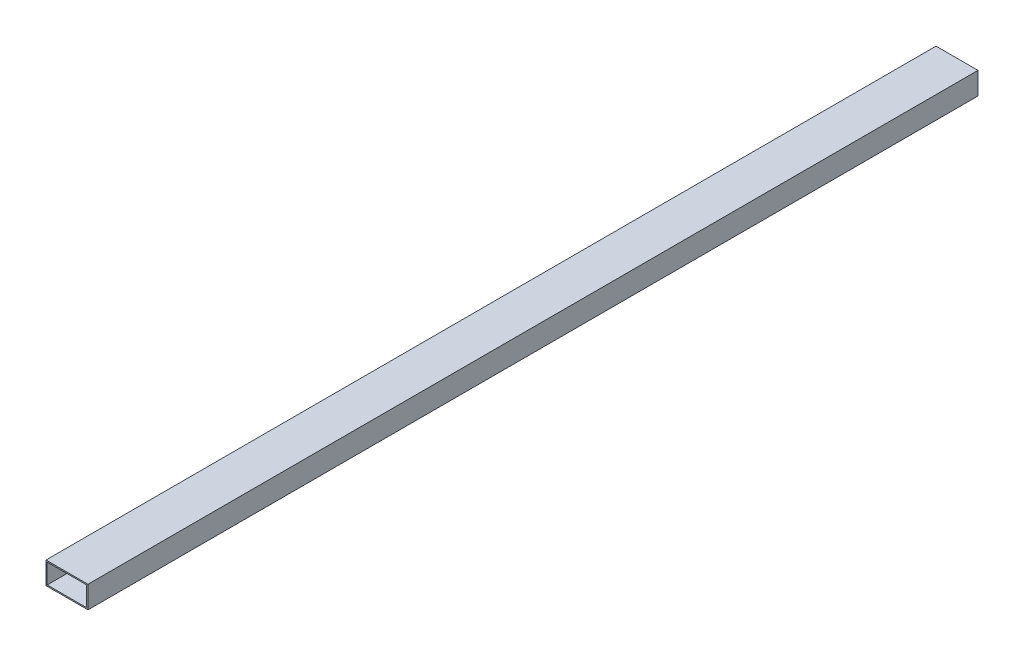
ISO-10303-21;
HEADER;
FILE_DESCRIPTION(('STEP AP214'),'2;1');
FILE_NAME('part.step','',(''),(''),'','','');
FILE_SCHEMA(('AUTOMOTIVE_DESIGN { 1 0 10303 214 1 1 1 1 }'));
ENDSEC;
DATA;
#1=APPLICATION_CONTEXT('core data for automotive mechanical design processes');
#2=APPLICATION_PROTOCOL_DEFINITION('international standard','automotive_design',2000,#1);
#3=PRODUCT_CONTEXT('',#1,'mechanical');
#4=PRODUCT('Part','Part','',(#3));
#5=PRODUCT_RELATED_PRODUCT_CATEGORY('part','',(#4));
#6=PRODUCT_DEFINITION_FORMATION('','',#4);
#7=PRODUCT_DEFINITION_CONTEXT('part definition',#1,'design');
#8=PRODUCT_DEFINITION('design','',#6,#7);
#9=PRODUCT_DEFINITION_SHAPE('','',#8);
#10=(LENGTH_UNIT() NAMED_UNIT(*) SI_UNIT(.MILLI.,.METRE.));
#11=(NAMED_UNIT(*) PLANE_ANGLE_UNIT() SI_UNIT($,.RADIAN.));
#12=(NAMED_UNIT(*) SI_UNIT($,.STERADIAN.) SOLID_ANGLE_UNIT());
#13=UNCERTAINTY_MEASURE_WITH_UNIT(LENGTH_MEASURE(1.E-05),#10,'distance_accuracy_value','');
#14=(GEOMETRIC_REPRESENTATION_CONTEXT(3) GLOBAL_UNCERTAINTY_ASSIGNED_CONTEXT((#13)) GLOBAL_UNIT_ASSIGNED_CONTEXT((#10,
#11,#12)) REPRESENTATION_CONTEXT('',''));
#15=CARTESIAN_POINT('',(0.,0.,0.));
#16=DIRECTION('',(0.,0.,1.));
#17=DIRECTION('',(1.,0.,0.));
#18=AXIS2_PLACEMENT_3D('',#15,#16,#17);
#19=CARTESIAN_POINT('',(0.,0.,1144.5875));
#20=DIRECTION('',(0.,0.,1.));
#21=DIRECTION('',(1.,0.,0.));
#22=AXIS2_PLACEMENT_3D('',#19,#20,#21);
#23=PLANE('',#22);
#24=DIRECTION('',(0.,-1.,0.));
#25=VECTOR('',#24,1.);
#26=CARTESIAN_POINT('',(-1.5875,0.,1144.5875));
#27=LINE('',#26,#25);
#28=CARTESIAN_POINT('',(-1.5875,1.5875,1144.5875));
#29=VERTEX_POINT('',#28);
#30=CARTESIAN_POINT('',(-1.5875,-26.9875,1144.5875));
#31=VERTEX_POINT('',#30);
#32=EDGE_CURVE('E160',#29,#31,#27,.T.);
#33=ORIENTED_EDGE('',*,*,#32,.T.);
#34=DIRECTION('',(1.,0.,0.));
#35=VECTOR('',#34,1.);
#36=CARTESIAN_POINT('',(0.,-26.9875,1144.5875));
#37=LINE('',#36,#35);
#38=CARTESIAN_POINT('',(52.3875,-26.9875,1144.5875));
#39=VERTEX_POINT('',#38);
#40=EDGE_CURVE('E163',#31,#39,#37,.T.);
#41=ORIENTED_EDGE('',*,*,#40,.T.);
#42=DIRECTION('',(0.,1.,0.));
#43=VECTOR('',#42,1.);
#44=CARTESIAN_POINT('',(52.3875,0.,1144.5875));
#45=LINE('',#44,#43);
#46=CARTESIAN_POINT('',(52.3875,1.5875,1144.5875));
#47=VERTEX_POINT('',#46);
#48=EDGE_CURVE('E166',#39,#47,#45,.T.);
#49=ORIENTED_EDGE('',*,*,#48,.T.);
#50=DIRECTION('',(-1.,0.,0.));
#51=VECTOR('',#50,1.);
#52=CARTESIAN_POINT('',(0.,1.5875,1144.5875));
#53=LINE('',#52,#51);
#54=EDGE_CURVE('E168',#47,#29,#53,.T.);
#55=ORIENTED_EDGE('',*,*,#54,.T.);
#56=EDGE_LOOP('',(#33,#41,#49,#55));
#57=FACE_BOUND('',#56,.T.);
#58=DIRECTION('',(1.,0.,0.));
#59=VECTOR('',#58,1.);
#60=CARTESIAN_POINT('',(0.,-25.4,1144.5875));
#61=LINE('',#60,#59);
#62=CARTESIAN_POINT('',(0.,-25.4,1144.5875));
#63=VERTEX_POINT('',#62);
#64=CARTESIAN_POINT('',(50.8,-25.4,1144.5875));
#65=VERTEX_POINT('',#64);
#66=EDGE_CURVE('E132',#63,#65,#61,.T.);
#67=ORIENTED_EDGE('',*,*,#66,.F.);
#68=DIRECTION('',(0.,-1.,0.));
#69=VECTOR('',#68,1.);
#70=CARTESIAN_POINT('',(0.,0.,1144.5875));
#71=LINE('',#70,#69);
#72=CARTESIAN_POINT('',(0.,0.,1144.5875));
#73=VERTEX_POINT('',#72);
#74=EDGE_CURVE('E124',#73,#63,#71,.T.);
#75=ORIENTED_EDGE('',*,*,#74,.F.);
#76=DIRECTION('',(-1.,0.,0.));
#77=VECTOR('',#76,1.);
#78=CARTESIAN_POINT('',(0.,0.,1144.5875));
#79=LINE('',#78,#77);
#80=CARTESIAN_POINT('',(50.8,0.,1144.5875));
#81=VERTEX_POINT('',#80);
#82=EDGE_CURVE('E146',#81,#73,#79,.T.);
#83=ORIENTED_EDGE('',*,*,#82,.F.);
#84=DIRECTION('',(0.,1.,0.));
#85=VECTOR('',#84,1.);
#86=CARTESIAN_POINT('',(50.8,0.,1144.5875));
#87=LINE('',#86,#85);
#88=EDGE_CURVE('E144',#65,#81,#87,.T.);
#89=ORIENTED_EDGE('',*,*,#88,.F.);
#90=EDGE_LOOP('',(#67,#75,#83,#89));
#91=FACE_BOUND('',#90,.T.);
#92=ADVANCED_FACE('F59',(#57,#91),#23,.T.);
#93=CARTESIAN_POINT('',(0.,0.,0.));
#94=DIRECTION('',(0.,0.,1.));
#95=DIRECTION('',(1.,0.,0.));
#96=AXIS2_PLACEMENT_3D('',#93,#94,#95);
#97=PLANE('',#96);
#98=DIRECTION('',(0.,-1.,0.));
#99=VECTOR('',#98,1.);
#100=CARTESIAN_POINT('',(-1.5875,0.,0.));
#101=LINE('',#100,#99);
#102=CARTESIAN_POINT('',(-1.5875,1.5875,0.));
#103=VERTEX_POINT('',#102);
#104=CARTESIAN_POINT('',(-1.5875,-26.9875,0.));
#105=VERTEX_POINT('',#104);
#106=EDGE_CURVE('E140',#103,#105,#101,.T.);
#107=ORIENTED_EDGE('',*,*,#106,.F.);
#108=DIRECTION('',(-1.,0.,0.));
#109=VECTOR('',#108,1.);
#110=CARTESIAN_POINT('',(0.,1.5875,0.));
#111=LINE('',#110,#109);
#112=CARTESIAN_POINT('',(52.3875,1.5875,0.));
#113=VERTEX_POINT('',#112);
#114=EDGE_CURVE('E164',#113,#103,#111,.T.);
#115=ORIENTED_EDGE('',*,*,#114,.F.);
#116=DIRECTION('',(0.,1.,0.));
#117=VECTOR('',#116,1.);
#118=CARTESIAN_POINT('',(52.3875,0.,0.));
#119=LINE('',#118,#117);
#120=CARTESIAN_POINT('',(52.3875,-26.9875,0.));
#121=VERTEX_POINT('',#120);
#122=EDGE_CURVE('E175',#121,#113,#119,.T.);
#123=ORIENTED_EDGE('',*,*,#122,.F.);
#124=DIRECTION('',(1.,0.,0.));
#125=VECTOR('',#124,1.);
#126=CARTESIAN_POINT('',(0.,-26.9875,0.));
#127=LINE('',#126,#125);
#128=EDGE_CURVE('E173',#105,#121,#127,.T.);
#129=ORIENTED_EDGE('',*,*,#128,.F.);
#130=EDGE_LOOP('',(#107,#115,#123,#129));
#131=FACE_BOUND('',#130,.T.);
#132=DIRECTION('',(0.,-1.,0.));
#133=VECTOR('',#132,1.);
#134=CARTESIAN_POINT('',(0.,0.,0.));
#135=LINE('',#134,#133);
#136=CARTESIAN_POINT('',(0.,0.,0.));
#137=VERTEX_POINT('',#136);
#138=CARTESIAN_POINT('',(0.,-25.4,0.));
#139=VERTEX_POINT('',#138);
#140=EDGE_CURVE('E82',#137,#139,#135,.T.);
#141=ORIENTED_EDGE('',*,*,#140,.T.);
#142=DIRECTION('',(1.,0.,0.));
#143=VECTOR('',#142,1.);
#144=CARTESIAN_POINT('',(0.,-25.4,0.));
#145=LINE('',#144,#143);
#146=CARTESIAN_POINT('',(50.8,-25.4,0.));
#147=VERTEX_POINT('',#146);
#148=EDGE_CURVE('E139',#139,#147,#145,.T.);
#149=ORIENTED_EDGE('',*,*,#148,.T.);
#150=DIRECTION('',(0.,1.,0.));
#151=VECTOR('',#150,1.);
#152=CARTESIAN_POINT('',(50.8,0.,0.));
#153=LINE('',#152,#151);
#154=CARTESIAN_POINT('',(50.8,0.,0.));
#155=VERTEX_POINT('',#154);
#156=EDGE_CURVE('E152',#147,#155,#153,.T.);
#157=ORIENTED_EDGE('',*,*,#156,.T.);
#158=DIRECTION('',(-1.,0.,0.));
#159=VECTOR('',#158,1.);
#160=CARTESIAN_POINT('',(0.,0.,0.));
#161=LINE('',#160,#159);
#162=EDGE_CURVE('E133',#155,#137,#161,.T.);
#163=ORIENTED_EDGE('',*,*,#162,.T.);
#164=EDGE_LOOP('',(#141,#149,#157,#163));
#165=FACE_BOUND('',#164,.T.);
#166=ADVANCED_FACE('F193',(#131,#165),#97,.F.);
#167=CARTESIAN_POINT('',(-1.5875,0.,1144.5875));
#168=DIRECTION('',(1.,0.,0.));
#169=DIRECTION('',(0.,1.,0.));
#170=AXIS2_PLACEMENT_3D('',#167,#168,#169);
#171=PLANE('',#170);
#172=ORIENTED_EDGE('',*,*,#106,.T.);
#173=DIRECTION('',(0.,0.,-1.));
#174=VECTOR('',#173,1.);
#175=CARTESIAN_POINT('',(-1.5875,-26.9875,1144.5875));
#176=LINE('',#175,#174);
#177=EDGE_CURVE('E12',#31,#105,#176,.T.);
#178=ORIENTED_EDGE('',*,*,#177,.F.);
#179=ORIENTED_EDGE('',*,*,#32,.F.);
#180=DIRECTION('',(0.,0.,-1.));
#181=VECTOR('',#180,1.);
#182=CARTESIAN_POINT('',(-1.5875,1.5875,1144.5875));
#183=LINE('',#182,#181);
#184=EDGE_CURVE('E170',#29,#103,#183,.T.);
#185=ORIENTED_EDGE('',*,*,#184,.T.);
#186=EDGE_LOOP('',(#172,#178,#179,#185));
#187=FACE_BOUND('',#186,.T.);
#188=ADVANCED_FACE('F61',(#187),#171,.F.);
#189=CARTESIAN_POINT('',(0.,-26.9875,1144.5875));
#190=DIRECTION('',(0.,1.,0.));
#191=DIRECTION('',(0.,0.,1.));
#192=AXIS2_PLACEMENT_3D('',#189,#190,#191);
#193=PLANE('',#192);
#194=ORIENTED_EDGE('',*,*,#128,.T.);
#195=DIRECTION('',(0.,0.,-1.));
#196=VECTOR('',#195,1.);
#197=CARTESIAN_POINT('',(52.3875,-26.9875,1144.5875));
#198=LINE('',#197,#196);
#199=EDGE_CURVE('E67',#39,#121,#198,.T.);
#200=ORIENTED_EDGE('',*,*,#199,.F.);
#201=ORIENTED_EDGE('',*,*,#40,.F.);
#202=ORIENTED_EDGE('',*,*,#177,.T.);
#203=EDGE_LOOP('',(#194,#200,#201,#202));
#204=FACE_BOUND('',#203,.T.);
#205=ADVANCED_FACE('F203',(#204),#193,.F.);
#206=CARTESIAN_POINT('',(52.3875,0.,1144.5875));
#207=DIRECTION('',(-1.,0.,0.));
#208=DIRECTION('',(0.,0.,1.));
#209=AXIS2_PLACEMENT_3D('',#206,#207,#208);
#210=PLANE('',#209);
#211=ORIENTED_EDGE('',*,*,#122,.T.);
#212=DIRECTION('',(0.,0.,-1.));
#213=VECTOR('',#212,1.);
#214=CARTESIAN_POINT('',(52.3875,1.5875,1144.5875));
#215=LINE('',#214,#213);
#216=EDGE_CURVE('E180',#47,#113,#215,.T.);
#217=ORIENTED_EDGE('',*,*,#216,.F.);
#218=ORIENTED_EDGE('',*,*,#48,.F.);
#219=ORIENTED_EDGE('',*,*,#199,.T.);
#220=EDGE_LOOP('',(#211,#217,#218,#219));
#221=FACE_BOUND('',#220,.T.);
#222=ADVANCED_FACE('F187',(#221),#210,.F.);
#223=CARTESIAN_POINT('',(0.,1.5875,1144.5875));
#224=DIRECTION('',(0.,-1.,0.));
#225=DIRECTION('',(0.,0.,-1.));
#226=AXIS2_PLACEMENT_3D('',#223,#224,#225);
#227=PLANE('',#226);
#228=ORIENTED_EDGE('',*,*,#114,.T.);
#229=ORIENTED_EDGE('',*,*,#184,.F.);
#230=ORIENTED_EDGE('',*,*,#54,.F.);
#231=ORIENTED_EDGE('',*,*,#216,.T.);
#232=EDGE_LOOP('',(#228,#229,#230,#231));
#233=FACE_BOUND('',#232,.T.);
#234=ADVANCED_FACE('F197',(#233),#227,.F.);
#235=CARTESIAN_POINT('',(0.,0.,1144.5875));
#236=DIRECTION('',(1.,0.,0.));
#237=DIRECTION('',(0.,1.,0.));
#238=AXIS2_PLACEMENT_3D('',#235,#236,#237);
#239=PLANE('',#238);
#240=ORIENTED_EDGE('',*,*,#140,.F.);
#241=DIRECTION('',(0.,0.,-1.));
#242=VECTOR('',#241,1.);
#243=CARTESIAN_POINT('',(0.,0.,1144.5875));
#244=LINE('',#243,#242);
#245=EDGE_CURVE('E128',#73,#137,#244,.T.);
#246=ORIENTED_EDGE('',*,*,#245,.F.);
#247=ORIENTED_EDGE('',*,*,#74,.T.);
#248=DIRECTION('',(0.,0.,-1.));
#249=VECTOR('',#248,1.);
#250=CARTESIAN_POINT('',(0.,-25.4,1144.5875));
#251=LINE('',#250,#249);
#252=EDGE_CURVE('E127',#63,#139,#251,.T.);
#253=ORIENTED_EDGE('',*,*,#252,.T.);
#254=EDGE_LOOP('',(#240,#246,#247,#253));
#255=FACE_BOUND('',#254,.T.);
#256=ADVANCED_FACE('F126',(#255),#239,.T.);
#257=CARTESIAN_POINT('',(0.,-25.4,1144.5875));
#258=DIRECTION('',(0.,1.,0.));
#259=DIRECTION('',(0.,0.,1.));
#260=AXIS2_PLACEMENT_3D('',#257,#258,#259);
#261=PLANE('',#260);
#262=ORIENTED_EDGE('',*,*,#148,.F.);
#263=ORIENTED_EDGE('',*,*,#252,.F.);
#264=ORIENTED_EDGE('',*,*,#66,.T.);
#265=DIRECTION('',(0.,0.,-1.));
#266=VECTOR('',#265,1.);
#267=CARTESIAN_POINT('',(50.8,-25.4,1144.5875));
#268=LINE('',#267,#266);
#269=EDGE_CURVE('E141',#65,#147,#268,.T.);
#270=ORIENTED_EDGE('',*,*,#269,.T.);
#271=EDGE_LOOP('',(#262,#263,#264,#270));
#272=FACE_BOUND('',#271,.T.);
#273=ADVANCED_FACE('F136',(#272),#261,.T.);
#274=CARTESIAN_POINT('',(50.8,0.,1144.5875));
#275=DIRECTION('',(-1.,0.,0.));
#276=DIRECTION('',(0.,0.,1.));
#277=AXIS2_PLACEMENT_3D('',#274,#275,#276);
#278=PLANE('',#277);
#279=ORIENTED_EDGE('',*,*,#156,.F.);
#280=ORIENTED_EDGE('',*,*,#269,.F.);
#281=ORIENTED_EDGE('',*,*,#88,.T.);
#282=DIRECTION('',(0.,0.,-1.));
#283=VECTOR('',#282,1.);
#284=CARTESIAN_POINT('',(50.8,0.,1144.5875));
#285=LINE('',#284,#283);
#286=EDGE_CURVE('E74',#81,#155,#285,.T.);
#287=ORIENTED_EDGE('',*,*,#286,.T.);
#288=EDGE_LOOP('',(#279,#280,#281,#287));
#289=FACE_BOUND('',#288,.T.);
#290=ADVANCED_FACE('F226',(#289),#278,.T.);
#291=CARTESIAN_POINT('',(0.,0.,1144.5875));
#292=DIRECTION('',(0.,-1.,0.));
#293=DIRECTION('',(0.,0.,-1.));
#294=AXIS2_PLACEMENT_3D('',#291,#292,#293);
#295=PLANE('',#294);
#296=ORIENTED_EDGE('',*,*,#162,.F.);
#297=ORIENTED_EDGE('',*,*,#286,.F.);
#298=ORIENTED_EDGE('',*,*,#82,.T.);
#299=ORIENTED_EDGE('',*,*,#245,.T.);
#300=EDGE_LOOP('',(#296,#297,#298,#299));
#301=FACE_BOUND('',#300,.T.);
#302=ADVANCED_FACE('F230',(#301),#295,.T.);
#303=CLOSED_SHELL('',(#92,#166,#188,#205,#222,#234,#256,#273,#290,#302));
#304=MANIFOLD_SOLID_BREP('B2',#303);
#305=ADVANCED_BREP_SHAPE_REPRESENTATION('',(#18,#304),#14);
#306=SHAPE_DEFINITION_REPRESENTATION(#9,#305);
ENDSEC;
END-ISO-10303-21;
